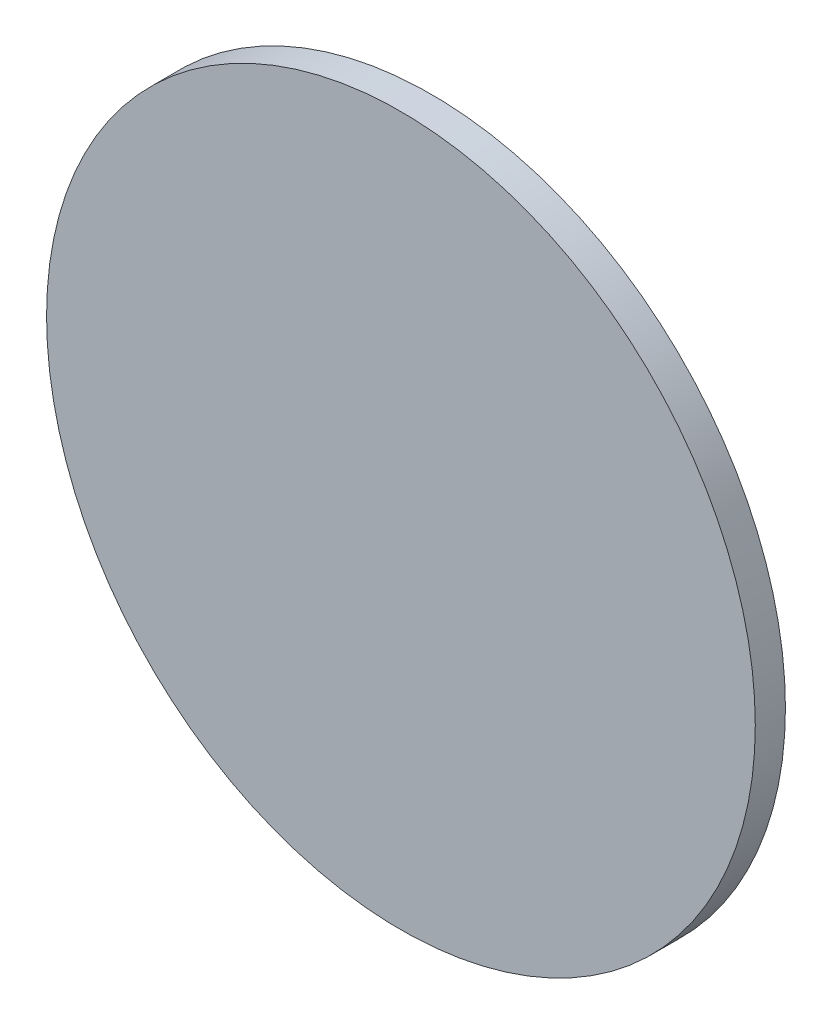
ISO-10303-21;
HEADER;
FILE_DESCRIPTION(('STEP AP214'),'2;1');
FILE_NAME('part.step','',(''),(''),'','','');
FILE_SCHEMA(('AUTOMOTIVE_DESIGN { 1 0 10303 214 1 1 1 1 }'));
ENDSEC;
DATA;
#1=APPLICATION_CONTEXT('core data for automotive mechanical design processes');
#2=APPLICATION_PROTOCOL_DEFINITION('international standard','automotive_design',2000,#1);
#3=PRODUCT_CONTEXT('',#1,'mechanical');
#4=PRODUCT('Part','Part','',(#3));
#5=PRODUCT_RELATED_PRODUCT_CATEGORY('part','',(#4));
#6=PRODUCT_DEFINITION_FORMATION('','',#4);
#7=PRODUCT_DEFINITION_CONTEXT('part definition',#1,'design');
#8=PRODUCT_DEFINITION('design','',#6,#7);
#9=PRODUCT_DEFINITION_SHAPE('','',#8);
#10=(LENGTH_UNIT() NAMED_UNIT(*) SI_UNIT(.MILLI.,.METRE.));
#11=(NAMED_UNIT(*) PLANE_ANGLE_UNIT() SI_UNIT($,.RADIAN.));
#12=(NAMED_UNIT(*) SI_UNIT($,.STERADIAN.) SOLID_ANGLE_UNIT());
#13=UNCERTAINTY_MEASURE_WITH_UNIT(LENGTH_MEASURE(1.E-05),#10,'distance_accuracy_value','');
#14=(GEOMETRIC_REPRESENTATION_CONTEXT(3) GLOBAL_UNCERTAINTY_ASSIGNED_CONTEXT((#13)) GLOBAL_UNIT_ASSIGNED_CONTEXT((#10,
#11,#12)) REPRESENTATION_CONTEXT('',''));
#15=CARTESIAN_POINT('',(0.,0.,0.));
#16=DIRECTION('',(0.,0.,1.));
#17=DIRECTION('',(1.,0.,0.));
#18=AXIS2_PLACEMENT_3D('',#15,#16,#17);
#19=CARTESIAN_POINT('',(0.,0.,0.81));
#20=DIRECTION('',(0.,0.,-1.));
#21=DIRECTION('',(-1.,0.,0.));
#22=AXIS2_PLACEMENT_3D('',#19,#20,#21);
#23=CYLINDRICAL_SURFACE('',#22,9.525);
#24=CARTESIAN_POINT('',(0.,0.,0.81));
#25=DIRECTION('',(0.,0.,1.));
#26=DIRECTION('',(1.,0.,0.));
#27=AXIS2_PLACEMENT_3D('',#24,#25,#26);
#28=CIRCLE('',#27,9.525);
#29=CARTESIAN_POINT('',(9.525,0.,0.81));
#30=VERTEX_POINT('',#29);
#31=EDGE_CURVE('E10',#30,#30,#28,.T.);
#32=ORIENTED_EDGE('',*,*,#31,.F.);
#33=EDGE_LOOP('',(#32));
#34=FACE_BOUND('',#33,.T.);
#35=CARTESIAN_POINT('',(0.,0.,0.));
#36=DIRECTION('',(0.,0.,1.));
#37=DIRECTION('',(1.,0.,0.));
#38=AXIS2_PLACEMENT_3D('',#35,#36,#37);
#39=CIRCLE('',#38,9.525);
#40=CARTESIAN_POINT('',(9.525,0.,0.));
#41=VERTEX_POINT('',#40);
#42=EDGE_CURVE('E34',#41,#41,#39,.T.);
#43=ORIENTED_EDGE('',*,*,#42,.T.);
#44=EDGE_LOOP('',(#43));
#45=FACE_BOUND('',#44,.T.);
#46=ADVANCED_FACE('F31',(#34,#45),#23,.T.);
#47=CARTESIAN_POINT('',(0.,0.,0.81));
#48=DIRECTION('',(0.,0.,1.));
#49=DIRECTION('',(1.,0.,0.));
#50=AXIS2_PLACEMENT_3D('',#47,#48,#49);
#51=PLANE('',#50);
#52=ORIENTED_EDGE('',*,*,#31,.T.);
#53=EDGE_LOOP('',(#52));
#54=FACE_BOUND('',#53,.T.);
#55=ADVANCED_FACE('F46',(#54),#51,.T.);
#56=CARTESIAN_POINT('',(0.,0.,0.));
#57=DIRECTION('',(0.,0.,1.));
#58=DIRECTION('',(1.,0.,0.));
#59=AXIS2_PLACEMENT_3D('',#56,#57,#58);
#60=PLANE('',#59);
#61=ORIENTED_EDGE('',*,*,#42,.F.);
#62=EDGE_LOOP('',(#61));
#63=FACE_BOUND('',#62,.T.);
#64=ADVANCED_FACE('F44',(#63),#60,.F.);
#65=CLOSED_SHELL('',(#46,#55,#64));
#66=MANIFOLD_SOLID_BREP('B2',#65);
#67=ADVANCED_BREP_SHAPE_REPRESENTATION('',(#18,#66),#14);
#68=SHAPE_DEFINITION_REPRESENTATION(#9,#67);
ENDSEC;
END-ISO-10303-21;
